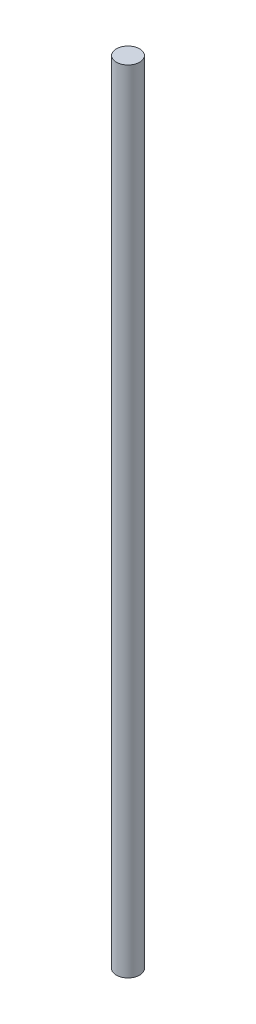
ISO-10303-21;
HEADER;
FILE_DESCRIPTION(('STEP AP214'),'2;1');
FILE_NAME('part.step','',(''),(''),'','','');
FILE_SCHEMA(('AUTOMOTIVE_DESIGN { 1 0 10303 214 1 1 1 1 }'));
ENDSEC;
DATA;
#1=APPLICATION_CONTEXT('core data for automotive mechanical design processes');
#2=APPLICATION_PROTOCOL_DEFINITION('international standard','automotive_design',2000,#1);
#3=PRODUCT_CONTEXT('',#1,'mechanical');
#4=PRODUCT('Part','Part','',(#3));
#5=PRODUCT_RELATED_PRODUCT_CATEGORY('part','',(#4));
#6=PRODUCT_DEFINITION_FORMATION('','',#4);
#7=PRODUCT_DEFINITION_CONTEXT('part definition',#1,'design');
#8=PRODUCT_DEFINITION('design','',#6,#7);
#9=PRODUCT_DEFINITION_SHAPE('','',#8);
#10=(LENGTH_UNIT() NAMED_UNIT(*) SI_UNIT(.MILLI.,.METRE.));
#11=(NAMED_UNIT(*) PLANE_ANGLE_UNIT() SI_UNIT($,.RADIAN.));
#12=(NAMED_UNIT(*) SI_UNIT($,.STERADIAN.) SOLID_ANGLE_UNIT());
#13=UNCERTAINTY_MEASURE_WITH_UNIT(LENGTH_MEASURE(1.E-05),#10,'distance_accuracy_value','');
#14=(GEOMETRIC_REPRESENTATION_CONTEXT(3) GLOBAL_UNCERTAINTY_ASSIGNED_CONTEXT((#13)) GLOBAL_UNIT_ASSIGNED_CONTEXT((#10,
#11,#12)) REPRESENTATION_CONTEXT('',''));
#15=CARTESIAN_POINT('',(0.,0.,0.));
#16=DIRECTION('',(0.,0.,1.));
#17=DIRECTION('',(1.,0.,0.));
#18=AXIS2_PLACEMENT_3D('',#15,#16,#17);
#19=CARTESIAN_POINT('',(0.,34.,0.));
#20=DIRECTION('',(0.,-1.,0.));
#21=DIRECTION('',(0.,0.,-1.));
#22=AXIS2_PLACEMENT_3D('',#19,#20,#21);
#23=CYLINDRICAL_SURFACE('',#22,0.5);
#24=CARTESIAN_POINT('',(0.,34.,0.));
#25=DIRECTION('',(0.,1.,0.));
#26=DIRECTION('',(0.,0.,1.));
#27=AXIS2_PLACEMENT_3D('',#24,#25,#26);
#28=CIRCLE('',#27,0.5);
#29=CARTESIAN_POINT('',(0.,34.,0.5));
#30=VERTEX_POINT('',#29);
#31=EDGE_CURVE('E10',#30,#30,#28,.T.);
#32=ORIENTED_EDGE('',*,*,#31,.F.);
#33=EDGE_LOOP('',(#32));
#34=FACE_BOUND('',#33,.T.);
#35=CARTESIAN_POINT('',(0.,0.,0.));
#36=DIRECTION('',(0.,1.,0.));
#37=DIRECTION('',(0.,0.,1.));
#38=AXIS2_PLACEMENT_3D('',#35,#36,#37);
#39=CIRCLE('',#38,0.5);
#40=CARTESIAN_POINT('',(0.,0.,0.5));
#41=VERTEX_POINT('',#40);
#42=EDGE_CURVE('E32',#41,#41,#39,.T.);
#43=ORIENTED_EDGE('',*,*,#42,.T.);
#44=EDGE_LOOP('',(#43));
#45=FACE_BOUND('',#44,.T.);
#46=ADVANCED_FACE('F29',(#34,#45),#23,.T.);
#47=CARTESIAN_POINT('',(0.,34.,0.));
#48=DIRECTION('',(0.,1.,0.));
#49=DIRECTION('',(0.,0.,1.));
#50=AXIS2_PLACEMENT_3D('',#47,#48,#49);
#51=PLANE('',#50);
#52=ORIENTED_EDGE('',*,*,#31,.T.);
#53=EDGE_LOOP('',(#52));
#54=FACE_BOUND('',#53,.T.);
#55=ADVANCED_FACE('F44',(#54),#51,.T.);
#56=CARTESIAN_POINT('',(0.,0.,0.));
#57=DIRECTION('',(0.,1.,0.));
#58=DIRECTION('',(0.,0.,1.));
#59=AXIS2_PLACEMENT_3D('',#56,#57,#58);
#60=PLANE('',#59);
#61=ORIENTED_EDGE('',*,*,#42,.F.);
#62=EDGE_LOOP('',(#61));
#63=FACE_BOUND('',#62,.T.);
#64=ADVANCED_FACE('F42',(#63),#60,.F.);
#65=CLOSED_SHELL('',(#46,#55,#64));
#66=MANIFOLD_SOLID_BREP('B2',#65);
#67=ADVANCED_BREP_SHAPE_REPRESENTATION('',(#18,#66),#14);
#68=SHAPE_DEFINITION_REPRESENTATION(#9,#67);
ENDSEC;
END-ISO-10303-21;
